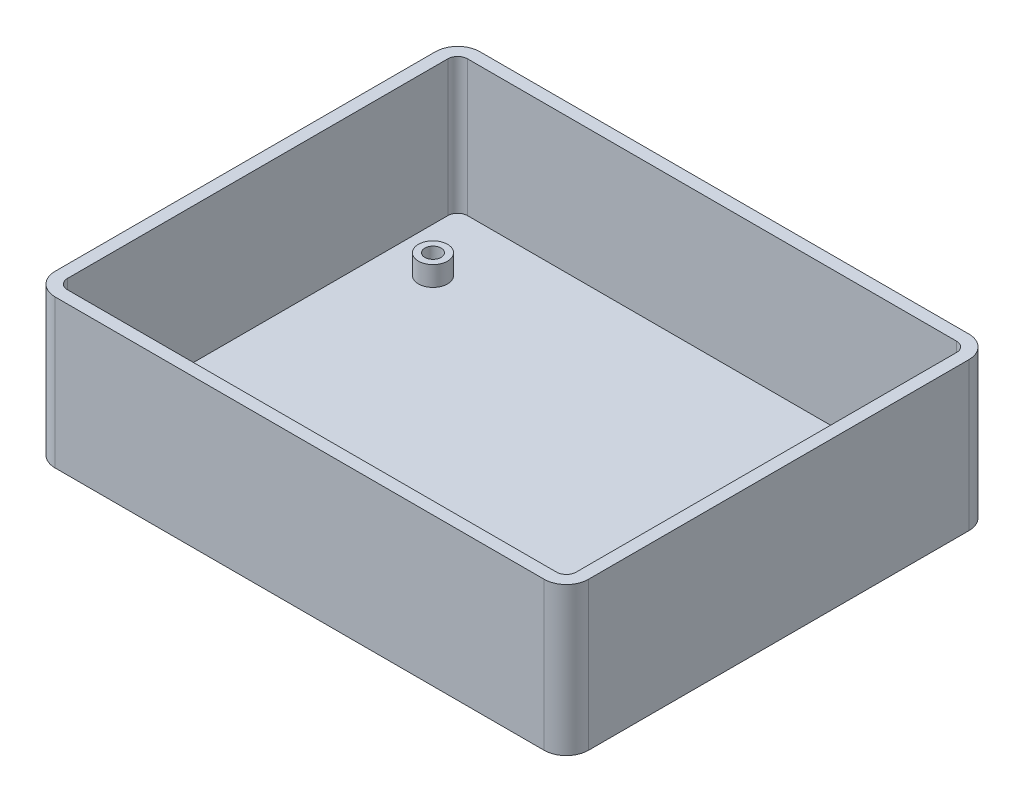
ISO-10303-21;
HEADER;
FILE_DESCRIPTION(('STEP AP214'),'2;1');
FILE_NAME('part.step','',(''),(''),'','','');
FILE_SCHEMA(('AUTOMOTIVE_DESIGN { 1 0 10303 214 1 1 1 1 }'));
ENDSEC;
DATA;
#1=APPLICATION_CONTEXT('core data for automotive mechanical design processes');
#2=APPLICATION_PROTOCOL_DEFINITION('international standard','automotive_design',2000,#1);
#3=PRODUCT_CONTEXT('',#1,'mechanical');
#4=PRODUCT('Part','Part','',(#3));
#5=PRODUCT_RELATED_PRODUCT_CATEGORY('part','',(#4));
#6=PRODUCT_DEFINITION_FORMATION('','',#4);
#7=PRODUCT_DEFINITION_CONTEXT('part definition',#1,'design');
#8=PRODUCT_DEFINITION('design','',#6,#7);
#9=PRODUCT_DEFINITION_SHAPE('','',#8);
#10=(LENGTH_UNIT() NAMED_UNIT(*) SI_UNIT(.MILLI.,.METRE.));
#11=(NAMED_UNIT(*) PLANE_ANGLE_UNIT() SI_UNIT($,.RADIAN.));
#12=(NAMED_UNIT(*) SI_UNIT($,.STERADIAN.) SOLID_ANGLE_UNIT());
#13=UNCERTAINTY_MEASURE_WITH_UNIT(LENGTH_MEASURE(1.E-05),#10,'distance_accuracy_value','');
#14=(GEOMETRIC_REPRESENTATION_CONTEXT(3) GLOBAL_UNCERTAINTY_ASSIGNED_CONTEXT((#13)) GLOBAL_UNIT_ASSIGNED_CONTEXT((#10,
#11,#12)) REPRESENTATION_CONTEXT('',''));
#15=CARTESIAN_POINT('',(0.,0.,0.));
#16=DIRECTION('',(0.,0.,1.));
#17=DIRECTION('',(1.,0.,0.));
#18=AXIS2_PLACEMENT_3D('',#15,#16,#17);
#19=CARTESIAN_POINT('',(0.,2.5,0.));
#20=DIRECTION('',(0.,1.,0.));
#21=DIRECTION('',(0.,0.,1.));
#22=AXIS2_PLACEMENT_3D('',#19,#20,#21);
#23=PLANE('',#22);
#24=CARTESIAN_POINT('',(41.,2.5,-31.));
#25=DIRECTION('',(0.,1.,0.));
#26=DIRECTION('',(0.,0.,1.));
#27=AXIS2_PLACEMENT_3D('',#24,#25,#26);
#28=CIRCLE('',#27,2.95);
#29=CARTESIAN_POINT('',(41.,2.5,-28.05));
#30=VERTEX_POINT('',#29);
#31=EDGE_CURVE('E697',#30,#30,#28,.T.);
#32=ORIENTED_EDGE('',*,*,#31,.F.);
#33=EDGE_LOOP('',(#32));
#34=FACE_BOUND('',#33,.T.);
#35=CARTESIAN_POINT('',(-41.,2.5,31.));
#36=DIRECTION('',(0.,1.,0.));
#37=DIRECTION('',(0.,0.,1.));
#38=AXIS2_PLACEMENT_3D('',#35,#36,#37);
#39=CIRCLE('',#38,2.95);
#40=CARTESIAN_POINT('',(-41.,2.5,33.95));
#41=VERTEX_POINT('',#40);
#42=EDGE_CURVE('E183',#41,#41,#39,.T.);
#43=ORIENTED_EDGE('',*,*,#42,.F.);
#44=EDGE_LOOP('',(#43));
#45=FACE_BOUND('',#44,.T.);
#46=DIRECTION('',(1.,0.,0.));
#47=VECTOR('',#46,1.);
#48=CARTESIAN_POINT('',(-50.,2.5,36.));
#49=LINE('',#48,#47);
#50=CARTESIAN_POINT('',(-48.,2.5,36.));
#51=VERTEX_POINT('',#50);
#52=CARTESIAN_POINT('',(51.,2.5,36.));
#53=VERTEX_POINT('',#52);
#54=EDGE_CURVE('E336',#51,#53,#49,.T.);
#55=ORIENTED_EDGE('',*,*,#54,.T.);
#56=CARTESIAN_POINT('',(51.,2.5,34.));
#57=DIRECTION('',(0.,1.,0.));
#58=DIRECTION('',(0.,0.,1.));
#59=AXIS2_PLACEMENT_3D('',#56,#57,#58);
#60=CIRCLE('',#59,2.);
#61=CARTESIAN_POINT('',(53.,2.5,34.));
#62=VERTEX_POINT('',#61);
#63=EDGE_CURVE('E11',#53,#62,#60,.T.);
#64=ORIENTED_EDGE('',*,*,#63,.T.);
#65=DIRECTION('',(0.,0.,-1.));
#66=VECTOR('',#65,1.);
#67=CARTESIAN_POINT('',(53.,2.5,-45.));
#68=LINE('',#67,#66);
#69=CARTESIAN_POINT('',(53.,2.5,-43.));
#70=VERTEX_POINT('',#69);
#71=EDGE_CURVE('E340',#62,#70,#68,.T.);
#72=ORIENTED_EDGE('',*,*,#71,.T.);
#73=CARTESIAN_POINT('',(51.,2.5,-43.));
#74=DIRECTION('',(0.,1.,0.));
#75=DIRECTION('',(0.,0.,1.));
#76=AXIS2_PLACEMENT_3D('',#73,#74,#75);
#77=CIRCLE('',#76,2.);
#78=CARTESIAN_POINT('',(51.,2.5,-45.));
#79=VERTEX_POINT('',#78);
#80=EDGE_CURVE('E48',#70,#79,#77,.T.);
#81=ORIENTED_EDGE('',*,*,#80,.T.);
#82=DIRECTION('',(-1.,0.,0.));
#83=VECTOR('',#82,1.);
#84=CARTESIAN_POINT('',(-50.,2.5,-45.));
#85=LINE('',#84,#83);
#86=CARTESIAN_POINT('',(-48.,2.5,-45.));
#87=VERTEX_POINT('',#86);
#88=EDGE_CURVE('E344',#79,#87,#85,.T.);
#89=ORIENTED_EDGE('',*,*,#88,.T.);
#90=CARTESIAN_POINT('',(-48.,2.5,-43.));
#91=DIRECTION('',(0.,1.,0.));
#92=DIRECTION('',(0.,0.,1.));
#93=AXIS2_PLACEMENT_3D('',#90,#91,#92);
#94=CIRCLE('',#93,2.);
#95=CARTESIAN_POINT('',(-50.,2.5,-43.));
#96=VERTEX_POINT('',#95);
#97=EDGE_CURVE('E348',#87,#96,#94,.T.);
#98=ORIENTED_EDGE('',*,*,#97,.T.);
#99=DIRECTION('',(0.,0.,1.));
#100=VECTOR('',#99,1.);
#101=CARTESIAN_POINT('',(-50.,2.5,-45.));
#102=LINE('',#101,#100);
#103=CARTESIAN_POINT('',(-50.,2.5,34.));
#104=VERTEX_POINT('',#103);
#105=EDGE_CURVE('E333',#96,#104,#102,.T.);
#106=ORIENTED_EDGE('',*,*,#105,.T.);
#107=CARTESIAN_POINT('',(-48.,2.5,34.));
#108=DIRECTION('',(0.,1.,0.));
#109=DIRECTION('',(0.,0.,1.));
#110=AXIS2_PLACEMENT_3D('',#107,#108,#109);
#111=CIRCLE('',#110,2.);
#112=EDGE_CURVE('E158',#104,#51,#111,.T.);
#113=ORIENTED_EDGE('',*,*,#112,.T.);
#114=EDGE_LOOP('',(#55,#64,#72,#81,#89,#98,#106,#113));
#115=FACE_BOUND('',#114,.T.);
#116=CARTESIAN_POINT('',(41.,2.5,31.));
#117=DIRECTION('',(0.,1.,0.));
#118=DIRECTION('',(0.,0.,1.));
#119=AXIS2_PLACEMENT_3D('',#116,#117,#118);
#120=CIRCLE('',#119,2.95);
#121=CARTESIAN_POINT('',(41.,2.5,33.95));
#122=VERTEX_POINT('',#121);
#123=EDGE_CURVE('E709',#122,#122,#120,.T.);
#124=ORIENTED_EDGE('',*,*,#123,.F.);
#125=EDGE_LOOP('',(#124));
#126=FACE_BOUND('',#125,.T.);
#127=CARTESIAN_POINT('',(-41.,2.5,-31.));
#128=DIRECTION('',(0.,1.,0.));
#129=DIRECTION('',(0.,0.,1.));
#130=AXIS2_PLACEMENT_3D('',#127,#128,#129);
#131=CIRCLE('',#130,2.95);
#132=CARTESIAN_POINT('',(-41.,2.5,-28.05));
#133=VERTEX_POINT('',#132);
#134=EDGE_CURVE('E682',#133,#133,#131,.T.);
#135=ORIENTED_EDGE('',*,*,#134,.F.);
#136=EDGE_LOOP('',(#135));
#137=FACE_BOUND('',#136,.T.);
#138=ADVANCED_FACE('F39',(#34,#45,#115,#126,#137),#23,.T.);
#139=CARTESIAN_POINT('',(0.,0.,0.));
#140=DIRECTION('',(0.,1.,0.));
#141=DIRECTION('',(0.,0.,1.));
#142=AXIS2_PLACEMENT_3D('',#139,#140,#141);
#143=PLANE('',#142);
#144=CARTESIAN_POINT('',(41.,0.,-31.));
#145=DIRECTION('',(0.,1.,0.));
#146=DIRECTION('',(0.,0.,1.));
#147=AXIS2_PLACEMENT_3D('',#144,#145,#146);
#148=CIRCLE('',#147,1.65);
#149=CARTESIAN_POINT('',(41.,0.,-29.35));
#150=VERTEX_POINT('',#149);
#151=EDGE_CURVE('E329',#150,#150,#148,.T.);
#152=ORIENTED_EDGE('',*,*,#151,.T.);
#153=EDGE_LOOP('',(#152));
#154=FACE_BOUND('',#153,.T.);
#155=CARTESIAN_POINT('',(41.,0.,31.));
#156=DIRECTION('',(0.,1.,0.));
#157=DIRECTION('',(0.,0.,1.));
#158=AXIS2_PLACEMENT_3D('',#155,#156,#157);
#159=CIRCLE('',#158,1.65);
#160=CARTESIAN_POINT('',(41.,0.,32.65));
#161=VERTEX_POINT('',#160);
#162=EDGE_CURVE('E325',#161,#161,#159,.T.);
#163=ORIENTED_EDGE('',*,*,#162,.T.);
#164=EDGE_LOOP('',(#163));
#165=FACE_BOUND('',#164,.T.);
#166=CARTESIAN_POINT('',(-41.,0.,31.));
#167=DIRECTION('',(0.,1.,0.));
#168=DIRECTION('',(0.,0.,1.));
#169=AXIS2_PLACEMENT_3D('',#166,#167,#168);
#170=CIRCLE('',#169,1.65);
#171=CARTESIAN_POINT('',(-41.,0.,32.65));
#172=VERTEX_POINT('',#171);
#173=EDGE_CURVE('E321',#172,#172,#170,.T.);
#174=ORIENTED_EDGE('',*,*,#173,.T.);
#175=EDGE_LOOP('',(#174));
#176=FACE_BOUND('',#175,.T.);
#177=CARTESIAN_POINT('',(-41.,0.,-31.));
#178=DIRECTION('',(0.,1.,0.));
#179=DIRECTION('',(0.,0.,1.));
#180=AXIS2_PLACEMENT_3D('',#177,#178,#179);
#181=CIRCLE('',#180,1.65);
#182=CARTESIAN_POINT('',(-41.,0.,-29.35));
#183=VERTEX_POINT('',#182);
#184=EDGE_CURVE('E297',#183,#183,#181,.T.);
#185=ORIENTED_EDGE('',*,*,#184,.T.);
#186=EDGE_LOOP('',(#185));
#187=FACE_BOUND('',#186,.T.);
#188=CARTESIAN_POINT('',(51.,0.,34.));
#189=DIRECTION('',(0.,-1.,0.));
#190=DIRECTION('',(0.,0.,-1.));
#191=AXIS2_PLACEMENT_3D('',#188,#189,#190);
#192=CIRCLE('',#191,4.5);
#193=CARTESIAN_POINT('',(55.5,0.,34.));
#194=VERTEX_POINT('',#193);
#195=CARTESIAN_POINT('',(51.,0.,38.5));
#196=VERTEX_POINT('',#195);
#197=EDGE_CURVE('E209',#194,#196,#192,.T.);
#198=ORIENTED_EDGE('',*,*,#197,.T.);
#199=DIRECTION('',(-1.,0.,0.));
#200=VECTOR('',#199,1.);
#201=CARTESIAN_POINT('',(51.,0.,38.5));
#202=LINE('',#201,#200);
#203=CARTESIAN_POINT('',(-48.,0.,38.5));
#204=VERTEX_POINT('',#203);
#205=EDGE_CURVE('E267',#196,#204,#202,.T.);
#206=ORIENTED_EDGE('',*,*,#205,.T.);
#207=CARTESIAN_POINT('',(-48.,0.,34.));
#208=DIRECTION('',(0.,-1.,0.));
#209=DIRECTION('',(0.,0.,-1.));
#210=AXIS2_PLACEMENT_3D('',#207,#208,#209);
#211=CIRCLE('',#210,4.5);
#212=CARTESIAN_POINT('',(-52.5,0.,34.));
#213=VERTEX_POINT('',#212);
#214=EDGE_CURVE('E271',#204,#213,#211,.T.);
#215=ORIENTED_EDGE('',*,*,#214,.T.);
#216=DIRECTION('',(0.,0.,-1.));
#217=VECTOR('',#216,1.);
#218=CARTESIAN_POINT('',(-52.5,0.,34.));
#219=LINE('',#218,#217);
#220=CARTESIAN_POINT('',(-52.5,0.,-43.));
#221=VERTEX_POINT('',#220);
#222=EDGE_CURVE('E275',#213,#221,#219,.T.);
#223=ORIENTED_EDGE('',*,*,#222,.T.);
#224=CARTESIAN_POINT('',(-48.,0.,-43.));
#225=DIRECTION('',(0.,-1.,0.));
#226=DIRECTION('',(0.,0.,-1.));
#227=AXIS2_PLACEMENT_3D('',#224,#225,#226);
#228=CIRCLE('',#227,4.5);
#229=CARTESIAN_POINT('',(-48.,0.,-47.5));
#230=VERTEX_POINT('',#229);
#231=EDGE_CURVE('E279',#221,#230,#228,.T.);
#232=ORIENTED_EDGE('',*,*,#231,.T.);
#233=DIRECTION('',(1.,0.,0.));
#234=VECTOR('',#233,1.);
#235=CARTESIAN_POINT('',(-48.,0.,-47.5));
#236=LINE('',#235,#234);
#237=CARTESIAN_POINT('',(51.,0.,-47.5));
#238=VERTEX_POINT('',#237);
#239=EDGE_CURVE('E283',#230,#238,#236,.T.);
#240=ORIENTED_EDGE('',*,*,#239,.T.);
#241=CARTESIAN_POINT('',(51.,0.,-43.));
#242=DIRECTION('',(0.,-1.,0.));
#243=DIRECTION('',(0.,0.,-1.));
#244=AXIS2_PLACEMENT_3D('',#241,#242,#243);
#245=CIRCLE('',#244,4.5);
#246=CARTESIAN_POINT('',(55.5,0.,-43.));
#247=VERTEX_POINT('',#246);
#248=EDGE_CURVE('E287',#238,#247,#245,.T.);
#249=ORIENTED_EDGE('',*,*,#248,.T.);
#250=DIRECTION('',(0.,0.,1.));
#251=VECTOR('',#250,1.);
#252=CARTESIAN_POINT('',(55.5,0.,-43.));
#253=LINE('',#252,#251);
#254=EDGE_CURVE('E235',#247,#194,#253,.T.);
#255=ORIENTED_EDGE('',*,*,#254,.T.);
#256=EDGE_LOOP('',(#198,#206,#215,#223,#232,#240,#249,#255));
#257=FACE_BOUND('',#256,.T.);
#258=ADVANCED_FACE('F41',(#154,#165,#176,#187,#257),#143,.F.);
#259=CARTESIAN_POINT('',(41.,2.5,-31.));
#260=DIRECTION('',(0.,-1.,0.));
#261=DIRECTION('',(0.,0.,-1.));
#262=AXIS2_PLACEMENT_3D('',#259,#260,#261);
#263=CYLINDRICAL_SURFACE('',#262,1.65);
#264=ORIENTED_EDGE('',*,*,#151,.F.);
#265=EDGE_LOOP('',(#264));
#266=FACE_BOUND('',#265,.T.);
#267=CARTESIAN_POINT('',(41.,6.5,-31.));
#268=DIRECTION('',(0.,1.,0.));
#269=DIRECTION('',(0.,0.,1.));
#270=AXIS2_PLACEMENT_3D('',#267,#268,#269);
#271=CIRCLE('',#270,1.65);
#272=CARTESIAN_POINT('',(41.,6.5,-29.35));
#273=VERTEX_POINT('',#272);
#274=EDGE_CURVE('E689',#273,#273,#271,.T.);
#275=ORIENTED_EDGE('',*,*,#274,.T.);
#276=EDGE_LOOP('',(#275));
#277=FACE_BOUND('',#276,.T.);
#278=ADVANCED_FACE('F385',(#266,#277),#263,.F.);
#279=CARTESIAN_POINT('',(41.,2.5,31.));
#280=DIRECTION('',(0.,-1.,0.));
#281=DIRECTION('',(0.,0.,-1.));
#282=AXIS2_PLACEMENT_3D('',#279,#280,#281);
#283=CYLINDRICAL_SURFACE('',#282,1.65);
#284=ORIENTED_EDGE('',*,*,#162,.F.);
#285=EDGE_LOOP('',(#284));
#286=FACE_BOUND('',#285,.T.);
#287=CARTESIAN_POINT('',(41.,6.5,31.));
#288=DIRECTION('',(0.,1.,0.));
#289=DIRECTION('',(0.,0.,1.));
#290=AXIS2_PLACEMENT_3D('',#287,#288,#289);
#291=CIRCLE('',#290,1.65);
#292=CARTESIAN_POINT('',(41.,6.5,32.65));
#293=VERTEX_POINT('',#292);
#294=EDGE_CURVE('E702',#293,#293,#291,.T.);
#295=ORIENTED_EDGE('',*,*,#294,.T.);
#296=EDGE_LOOP('',(#295));
#297=FACE_BOUND('',#296,.T.);
#298=ADVANCED_FACE('F392',(#286,#297),#283,.F.);
#299=CARTESIAN_POINT('',(-41.,2.5,31.));
#300=DIRECTION('',(0.,-1.,0.));
#301=DIRECTION('',(0.,0.,-1.));
#302=AXIS2_PLACEMENT_3D('',#299,#300,#301);
#303=CYLINDRICAL_SURFACE('',#302,1.65);
#304=ORIENTED_EDGE('',*,*,#173,.F.);
#305=EDGE_LOOP('',(#304));
#306=FACE_BOUND('',#305,.T.);
#307=CARTESIAN_POINT('',(-41.,6.5,31.));
#308=DIRECTION('',(0.,1.,0.));
#309=DIRECTION('',(0.,0.,1.));
#310=AXIS2_PLACEMENT_3D('',#307,#308,#309);
#311=CIRCLE('',#310,1.65);
#312=CARTESIAN_POINT('',(-41.,6.5,32.65));
#313=VERTEX_POINT('',#312);
#314=EDGE_CURVE('E714',#313,#313,#311,.T.);
#315=ORIENTED_EDGE('',*,*,#314,.T.);
#316=EDGE_LOOP('',(#315));
#317=FACE_BOUND('',#316,.T.);
#318=ADVANCED_FACE('F396',(#306,#317),#303,.F.);
#319=CARTESIAN_POINT('',(-41.,2.5,-31.));
#320=DIRECTION('',(0.,-1.,0.));
#321=DIRECTION('',(0.,0.,-1.));
#322=AXIS2_PLACEMENT_3D('',#319,#320,#321);
#323=CYLINDRICAL_SURFACE('',#322,1.65);
#324=ORIENTED_EDGE('',*,*,#184,.F.);
#325=EDGE_LOOP('',(#324));
#326=FACE_BOUND('',#325,.T.);
#327=CARTESIAN_POINT('',(-41.,6.5,-31.));
#328=DIRECTION('',(0.,1.,0.));
#329=DIRECTION('',(0.,0.,1.));
#330=AXIS2_PLACEMENT_3D('',#327,#328,#329);
#331=CIRCLE('',#330,1.65);
#332=CARTESIAN_POINT('',(-41.,6.5,-29.35));
#333=VERTEX_POINT('',#332);
#334=EDGE_CURVE('E685',#333,#333,#331,.T.);
#335=ORIENTED_EDGE('',*,*,#334,.T.);
#336=EDGE_LOOP('',(#335));
#337=FACE_BOUND('',#336,.T.);
#338=ADVANCED_FACE('F400',(#326,#337),#323,.F.);
#339=CARTESIAN_POINT('',(51.,30.,34.));
#340=DIRECTION('',(0.,-1.,0.));
#341=DIRECTION('',(0.,0.,-1.));
#342=AXIS2_PLACEMENT_3D('',#339,#340,#341);
#343=CYLINDRICAL_SURFACE('',#342,4.5);
#344=ORIENTED_EDGE('',*,*,#197,.F.);
#345=DIRECTION('',(0.,-1.,0.));
#346=VECTOR('',#345,1.);
#347=CARTESIAN_POINT('',(55.5,30.,34.));
#348=LINE('',#347,#346);
#349=CARTESIAN_POINT('',(55.5,30.,34.));
#350=VERTEX_POINT('',#349);
#351=EDGE_CURVE('E294',#350,#194,#348,.T.);
#352=ORIENTED_EDGE('',*,*,#351,.F.);
#353=CARTESIAN_POINT('',(51.,30.,34.));
#354=DIRECTION('',(0.,-1.,0.));
#355=DIRECTION('',(0.,0.,-1.));
#356=AXIS2_PLACEMENT_3D('',#353,#354,#355);
#357=CIRCLE('',#356,4.5);
#358=CARTESIAN_POINT('',(51.,30.,38.5));
#359=VERTEX_POINT('',#358);
#360=EDGE_CURVE('E230',#350,#359,#357,.T.);
#361=ORIENTED_EDGE('',*,*,#360,.T.);
#362=DIRECTION('',(0.,-1.,0.));
#363=VECTOR('',#362,1.);
#364=CARTESIAN_POINT('',(51.,30.,38.5));
#365=LINE('',#364,#363);
#366=EDGE_CURVE('E263',#359,#196,#365,.T.);
#367=ORIENTED_EDGE('',*,*,#366,.T.);
#368=EDGE_LOOP('',(#344,#352,#361,#367));
#369=FACE_BOUND('',#368,.T.);
#370=ADVANCED_FACE('F404',(#369),#343,.T.);
#371=CARTESIAN_POINT('',(55.5,30.,-43.));
#372=DIRECTION('',(1.,0.,0.));
#373=DIRECTION('',(0.,0.,-1.));
#374=AXIS2_PLACEMENT_3D('',#371,#372,#373);
#375=PLANE('',#374);
#376=ORIENTED_EDGE('',*,*,#254,.F.);
#377=DIRECTION('',(0.,-1.,0.));
#378=VECTOR('',#377,1.);
#379=CARTESIAN_POINT('',(55.5,30.,-43.));
#380=LINE('',#379,#378);
#381=CARTESIAN_POINT('',(55.5,30.,-43.));
#382=VERTEX_POINT('',#381);
#383=EDGE_CURVE('E298',#382,#247,#380,.T.);
#384=ORIENTED_EDGE('',*,*,#383,.F.);
#385=DIRECTION('',(0.,0.,1.));
#386=VECTOR('',#385,1.);
#387=CARTESIAN_POINT('',(55.5,30.,-43.));
#388=LINE('',#387,#386);
#389=EDGE_CURVE('E259',#382,#350,#388,.T.);
#390=ORIENTED_EDGE('',*,*,#389,.T.);
#391=ORIENTED_EDGE('',*,*,#351,.T.);
#392=EDGE_LOOP('',(#376,#384,#390,#391));
#393=FACE_BOUND('',#392,.T.);
#394=ADVANCED_FACE('F408',(#393),#375,.T.);
#395=CARTESIAN_POINT('',(51.,30.,-43.));
#396=DIRECTION('',(0.,-1.,0.));
#397=DIRECTION('',(0.,0.,-1.));
#398=AXIS2_PLACEMENT_3D('',#395,#396,#397);
#399=CYLINDRICAL_SURFACE('',#398,4.5);
#400=ORIENTED_EDGE('',*,*,#248,.F.);
#401=DIRECTION('',(0.,-1.,0.));
#402=VECTOR('',#401,1.);
#403=CARTESIAN_POINT('',(51.,30.,-47.5));
#404=LINE('',#403,#402);
#405=CARTESIAN_POINT('',(51.,30.,-47.5));
#406=VERTEX_POINT('',#405);
#407=EDGE_CURVE('E301',#406,#238,#404,.T.);
#408=ORIENTED_EDGE('',*,*,#407,.F.);
#409=CARTESIAN_POINT('',(51.,30.,-43.));
#410=DIRECTION('',(0.,-1.,0.));
#411=DIRECTION('',(0.,0.,-1.));
#412=AXIS2_PLACEMENT_3D('',#409,#410,#411);
#413=CIRCLE('',#412,4.5);
#414=EDGE_CURVE('E255',#406,#382,#413,.T.);
#415=ORIENTED_EDGE('',*,*,#414,.T.);
#416=ORIENTED_EDGE('',*,*,#383,.T.);
#417=EDGE_LOOP('',(#400,#408,#415,#416));
#418=FACE_BOUND('',#417,.T.);
#419=ADVANCED_FACE('F429',(#418),#399,.T.);
#420=CARTESIAN_POINT('',(-48.,30.,-47.5));
#421=DIRECTION('',(0.,0.,-1.));
#422=DIRECTION('',(-1.,0.,0.));
#423=AXIS2_PLACEMENT_3D('',#420,#421,#422);
#424=PLANE('',#423);
#425=ORIENTED_EDGE('',*,*,#239,.F.);
#426=DIRECTION('',(0.,-1.,0.));
#427=VECTOR('',#426,1.);
#428=CARTESIAN_POINT('',(-48.,30.,-47.5));
#429=LINE('',#428,#427);
#430=CARTESIAN_POINT('',(-48.,30.,-47.5));
#431=VERTEX_POINT('',#430);
#432=EDGE_CURVE('E304',#431,#230,#429,.T.);
#433=ORIENTED_EDGE('',*,*,#432,.F.);
#434=DIRECTION('',(1.,0.,0.));
#435=VECTOR('',#434,1.);
#436=CARTESIAN_POINT('',(-48.,30.,-47.5));
#437=LINE('',#436,#435);
#438=EDGE_CURVE('E251',#431,#406,#437,.T.);
#439=ORIENTED_EDGE('',*,*,#438,.T.);
#440=ORIENTED_EDGE('',*,*,#407,.T.);
#441=EDGE_LOOP('',(#425,#433,#439,#440));
#442=FACE_BOUND('',#441,.T.);
#443=ADVANCED_FACE('F425',(#442),#424,.T.);
#444=CARTESIAN_POINT('',(-48.,30.,-43.));
#445=DIRECTION('',(0.,-1.,0.));
#446=DIRECTION('',(0.,0.,-1.));
#447=AXIS2_PLACEMENT_3D('',#444,#445,#446);
#448=CYLINDRICAL_SURFACE('',#447,4.5);
#449=ORIENTED_EDGE('',*,*,#231,.F.);
#450=DIRECTION('',(0.,-1.,0.));
#451=VECTOR('',#450,1.);
#452=CARTESIAN_POINT('',(-52.5,30.,-43.));
#453=LINE('',#452,#451);
#454=CARTESIAN_POINT('',(-52.5,30.,-43.));
#455=VERTEX_POINT('',#454);
#456=EDGE_CURVE('E307',#455,#221,#453,.T.);
#457=ORIENTED_EDGE('',*,*,#456,.F.);
#458=CARTESIAN_POINT('',(-48.,30.,-43.));
#459=DIRECTION('',(0.,-1.,0.));
#460=DIRECTION('',(0.,0.,-1.));
#461=AXIS2_PLACEMENT_3D('',#458,#459,#460);
#462=CIRCLE('',#461,4.5);
#463=EDGE_CURVE('E247',#455,#431,#462,.T.);
#464=ORIENTED_EDGE('',*,*,#463,.T.);
#465=ORIENTED_EDGE('',*,*,#432,.T.);
#466=EDGE_LOOP('',(#449,#457,#464,#465));
#467=FACE_BOUND('',#466,.T.);
#468=ADVANCED_FACE('F421',(#467),#448,.T.);
#469=CARTESIAN_POINT('',(-52.5,30.,34.));
#470=DIRECTION('',(-1.,0.,0.));
#471=DIRECTION('',(0.,0.,1.));
#472=AXIS2_PLACEMENT_3D('',#469,#470,#471);
#473=PLANE('',#472);
#474=ORIENTED_EDGE('',*,*,#222,.F.);
#475=DIRECTION('',(0.,-1.,0.));
#476=VECTOR('',#475,1.);
#477=CARTESIAN_POINT('',(-52.5,30.,34.));
#478=LINE('',#477,#476);
#479=CARTESIAN_POINT('',(-52.5,30.,34.));
#480=VERTEX_POINT('',#479);
#481=EDGE_CURVE('E310',#480,#213,#478,.T.);
#482=ORIENTED_EDGE('',*,*,#481,.F.);
#483=DIRECTION('',(0.,0.,-1.));
#484=VECTOR('',#483,1.);
#485=CARTESIAN_POINT('',(-52.5,30.,34.));
#486=LINE('',#485,#484);
#487=EDGE_CURVE('E243',#480,#455,#486,.T.);
#488=ORIENTED_EDGE('',*,*,#487,.T.);
#489=ORIENTED_EDGE('',*,*,#456,.T.);
#490=EDGE_LOOP('',(#474,#482,#488,#489));
#491=FACE_BOUND('',#490,.T.);
#492=ADVANCED_FACE('F417',(#491),#473,.T.);
#493=CARTESIAN_POINT('',(-48.,30.,34.));
#494=DIRECTION('',(0.,-1.,0.));
#495=DIRECTION('',(0.,0.,-1.));
#496=AXIS2_PLACEMENT_3D('',#493,#494,#495);
#497=CYLINDRICAL_SURFACE('',#496,4.5);
#498=ORIENTED_EDGE('',*,*,#214,.F.);
#499=DIRECTION('',(0.,-1.,0.));
#500=VECTOR('',#499,1.);
#501=CARTESIAN_POINT('',(-48.,30.,38.5));
#502=LINE('',#501,#500);
#503=CARTESIAN_POINT('',(-48.,30.,38.5));
#504=VERTEX_POINT('',#503);
#505=EDGE_CURVE('E313',#504,#204,#502,.T.);
#506=ORIENTED_EDGE('',*,*,#505,.F.);
#507=CARTESIAN_POINT('',(-48.,30.,34.));
#508=DIRECTION('',(0.,-1.,0.));
#509=DIRECTION('',(0.,0.,-1.));
#510=AXIS2_PLACEMENT_3D('',#507,#508,#509);
#511=CIRCLE('',#510,4.5);
#512=EDGE_CURVE('E239',#504,#480,#511,.T.);
#513=ORIENTED_EDGE('',*,*,#512,.T.);
#514=ORIENTED_EDGE('',*,*,#481,.T.);
#515=EDGE_LOOP('',(#498,#506,#513,#514));
#516=FACE_BOUND('',#515,.T.);
#517=ADVANCED_FACE('F413',(#516),#497,.T.);
#518=CARTESIAN_POINT('',(51.,30.,38.5));
#519=DIRECTION('',(0.,0.,1.));
#520=DIRECTION('',(1.,0.,0.));
#521=AXIS2_PLACEMENT_3D('',#518,#519,#520);
#522=PLANE('',#521);
#523=ORIENTED_EDGE('',*,*,#205,.F.);
#524=ORIENTED_EDGE('',*,*,#366,.F.);
#525=DIRECTION('',(-1.,0.,0.));
#526=VECTOR('',#525,1.);
#527=CARTESIAN_POINT('',(51.,30.,38.5));
#528=LINE('',#527,#526);
#529=EDGE_CURVE('E234',#359,#504,#528,.T.);
#530=ORIENTED_EDGE('',*,*,#529,.T.);
#531=ORIENTED_EDGE('',*,*,#505,.T.);
#532=EDGE_LOOP('',(#523,#524,#530,#531));
#533=FACE_BOUND('',#532,.T.);
#534=ADVANCED_FACE('F410',(#533),#522,.T.);
#535=CARTESIAN_POINT('',(51.,30.,34.));
#536=DIRECTION('',(0.,-1.,0.));
#537=DIRECTION('',(0.,0.,-1.));
#538=AXIS2_PLACEMENT_3D('',#535,#536,#537);
#539=PLANE('',#538);
#540=DIRECTION('',(-1.,0.,0.));
#541=VECTOR('',#540,1.);
#542=CARTESIAN_POINT('',(51.,30.,36.));
#543=LINE('',#542,#541);
#544=CARTESIAN_POINT('',(51.,30.,36.));
#545=VERTEX_POINT('',#544);
#546=CARTESIAN_POINT('',(-48.,30.,36.));
#547=VERTEX_POINT('',#546);
#548=EDGE_CURVE('E162',#545,#547,#543,.T.);
#549=ORIENTED_EDGE('',*,*,#548,.T.);
#550=CARTESIAN_POINT('',(-48.,30.,34.));
#551=DIRECTION('',(0.,-1.,0.));
#552=DIRECTION('',(0.,0.,-1.));
#553=AXIS2_PLACEMENT_3D('',#550,#551,#552);
#554=CIRCLE('',#553,2.);
#555=CARTESIAN_POINT('',(-50.,30.,34.));
#556=VERTEX_POINT('',#555);
#557=EDGE_CURVE('E155',#547,#556,#554,.T.);
#558=ORIENTED_EDGE('',*,*,#557,.T.);
#559=DIRECTION('',(0.,0.,-1.));
#560=VECTOR('',#559,1.);
#561=CARTESIAN_POINT('',(-50.,30.,34.));
#562=LINE('',#561,#560);
#563=CARTESIAN_POINT('',(-50.,30.,-43.));
#564=VERTEX_POINT('',#563);
#565=EDGE_CURVE('E166',#556,#564,#562,.T.);
#566=ORIENTED_EDGE('',*,*,#565,.T.);
#567=CARTESIAN_POINT('',(-48.,30.,-43.));
#568=DIRECTION('',(0.,-1.,0.));
#569=DIRECTION('',(0.,0.,-1.));
#570=AXIS2_PLACEMENT_3D('',#567,#568,#569);
#571=CIRCLE('',#570,2.);
#572=CARTESIAN_POINT('',(-48.,30.,-45.));
#573=VERTEX_POINT('',#572);
#574=EDGE_CURVE('E172',#564,#573,#571,.T.);
#575=ORIENTED_EDGE('',*,*,#574,.T.);
#576=DIRECTION('',(1.,0.,0.));
#577=VECTOR('',#576,1.);
#578=CARTESIAN_POINT('',(-48.,30.,-45.));
#579=LINE('',#578,#577);
#580=CARTESIAN_POINT('',(51.,30.,-45.));
#581=VERTEX_POINT('',#580);
#582=EDGE_CURVE('E189',#573,#581,#579,.T.);
#583=ORIENTED_EDGE('',*,*,#582,.T.);
#584=CARTESIAN_POINT('',(51.,30.,-43.));
#585=DIRECTION('',(0.,-1.,0.));
#586=DIRECTION('',(0.,0.,-1.));
#587=AXIS2_PLACEMENT_3D('',#584,#585,#586);
#588=CIRCLE('',#587,2.);
#589=CARTESIAN_POINT('',(53.,30.,-43.));
#590=VERTEX_POINT('',#589);
#591=EDGE_CURVE('E193',#581,#590,#588,.T.);
#592=ORIENTED_EDGE('',*,*,#591,.T.);
#593=DIRECTION('',(0.,0.,1.));
#594=VECTOR('',#593,1.);
#595=CARTESIAN_POINT('',(53.,30.,-43.));
#596=LINE('',#595,#594);
#597=CARTESIAN_POINT('',(53.,30.,34.));
#598=VERTEX_POINT('',#597);
#599=EDGE_CURVE('E197',#590,#598,#596,.T.);
#600=ORIENTED_EDGE('',*,*,#599,.T.);
#601=CARTESIAN_POINT('',(51.,30.,34.));
#602=DIRECTION('',(0.,-1.,0.));
#603=DIRECTION('',(0.,0.,-1.));
#604=AXIS2_PLACEMENT_3D('',#601,#602,#603);
#605=CIRCLE('',#604,2.);
#606=EDGE_CURVE('E201',#598,#545,#605,.T.);
#607=ORIENTED_EDGE('',*,*,#606,.T.);
#608=EDGE_LOOP('',(#549,#558,#566,#575,#583,#592,#600,#607));
#609=FACE_BOUND('',#608,.T.);
#610=ORIENTED_EDGE('',*,*,#360,.F.);
#611=ORIENTED_EDGE('',*,*,#389,.F.);
#612=ORIENTED_EDGE('',*,*,#414,.F.);
#613=ORIENTED_EDGE('',*,*,#438,.F.);
#614=ORIENTED_EDGE('',*,*,#463,.F.);
#615=ORIENTED_EDGE('',*,*,#487,.F.);
#616=ORIENTED_EDGE('',*,*,#512,.F.);
#617=ORIENTED_EDGE('',*,*,#529,.F.);
#618=EDGE_LOOP('',(#610,#611,#612,#613,#614,#615,#616,#617));
#619=FACE_BOUND('',#618,.T.);
#620=ADVANCED_FACE('F174',(#609,#619),#539,.F.);
#621=CARTESIAN_POINT('',(-48.,30.,34.));
#622=DIRECTION('',(0.,-1.,0.));
#623=DIRECTION('',(0.,0.,-1.));
#624=AXIS2_PLACEMENT_3D('',#621,#622,#623);
#625=CYLINDRICAL_SURFACE('',#624,2.);
#626=ORIENTED_EDGE('',*,*,#112,.F.);
#627=DIRECTION('',(0.,-1.,0.));
#628=VECTOR('',#627,1.);
#629=CARTESIAN_POINT('',(-50.,30.,34.));
#630=LINE('',#629,#628);
#631=EDGE_CURVE('E55',#556,#104,#630,.T.);
#632=ORIENTED_EDGE('',*,*,#631,.F.);
#633=ORIENTED_EDGE('',*,*,#557,.F.);
#634=DIRECTION('',(0.,-1.,0.));
#635=VECTOR('',#634,1.);
#636=CARTESIAN_POINT('',(-48.,30.,36.));
#637=LINE('',#636,#635);
#638=EDGE_CURVE('E206',#547,#51,#637,.T.);
#639=ORIENTED_EDGE('',*,*,#638,.T.);
#640=EDGE_LOOP('',(#626,#632,#633,#639));
#641=FACE_BOUND('',#640,.T.);
#642=ADVANCED_FACE('F152',(#641),#625,.F.);
#643=CARTESIAN_POINT('',(51.,30.,36.));
#644=DIRECTION('',(0.,0.,1.));
#645=DIRECTION('',(1.,0.,0.));
#646=AXIS2_PLACEMENT_3D('',#643,#644,#645);
#647=PLANE('',#646);
#648=ORIENTED_EDGE('',*,*,#54,.F.);
#649=ORIENTED_EDGE('',*,*,#638,.F.);
#650=ORIENTED_EDGE('',*,*,#548,.F.);
#651=DIRECTION('',(0.,-1.,0.));
#652=VECTOR('',#651,1.);
#653=CARTESIAN_POINT('',(51.,30.,36.));
#654=LINE('',#653,#652);
#655=EDGE_CURVE('E210',#545,#53,#654,.T.);
#656=ORIENTED_EDGE('',*,*,#655,.T.);
#657=EDGE_LOOP('',(#648,#649,#650,#656));
#658=FACE_BOUND('',#657,.T.);
#659=ADVANCED_FACE('F370',(#658),#647,.F.);
#660=CARTESIAN_POINT('',(51.,30.,34.));
#661=DIRECTION('',(0.,-1.,0.));
#662=DIRECTION('',(0.,0.,-1.));
#663=AXIS2_PLACEMENT_3D('',#660,#661,#662);
#664=CYLINDRICAL_SURFACE('',#663,2.);
#665=ORIENTED_EDGE('',*,*,#63,.F.);
#666=ORIENTED_EDGE('',*,*,#655,.F.);
#667=ORIENTED_EDGE('',*,*,#606,.F.);
#668=DIRECTION('',(0.,-1.,0.));
#669=VECTOR('',#668,1.);
#670=CARTESIAN_POINT('',(53.,30.,34.));
#671=LINE('',#670,#669);
#672=EDGE_CURVE('E214',#598,#62,#671,.T.);
#673=ORIENTED_EDGE('',*,*,#672,.T.);
#674=EDGE_LOOP('',(#665,#666,#667,#673));
#675=FACE_BOUND('',#674,.T.);
#676=ADVANCED_FACE('F361',(#675),#664,.F.);
#677=CARTESIAN_POINT('',(53.,30.,-43.));
#678=DIRECTION('',(1.,0.,0.));
#679=DIRECTION('',(0.,0.,-1.));
#680=AXIS2_PLACEMENT_3D('',#677,#678,#679);
#681=PLANE('',#680);
#682=ORIENTED_EDGE('',*,*,#71,.F.);
#683=ORIENTED_EDGE('',*,*,#672,.F.);
#684=ORIENTED_EDGE('',*,*,#599,.F.);
#685=DIRECTION('',(0.,-1.,0.));
#686=VECTOR('',#685,1.);
#687=CARTESIAN_POINT('',(53.,30.,-43.));
#688=LINE('',#687,#686);
#689=EDGE_CURVE('E218',#590,#70,#688,.T.);
#690=ORIENTED_EDGE('',*,*,#689,.T.);
#691=EDGE_LOOP('',(#682,#683,#684,#690));
#692=FACE_BOUND('',#691,.T.);
#693=ADVANCED_FACE('F357',(#692),#681,.F.);
#694=CARTESIAN_POINT('',(51.,30.,-43.));
#695=DIRECTION('',(0.,-1.,0.));
#696=DIRECTION('',(0.,0.,-1.));
#697=AXIS2_PLACEMENT_3D('',#694,#695,#696);
#698=CYLINDRICAL_SURFACE('',#697,2.);
#699=ORIENTED_EDGE('',*,*,#80,.F.);
#700=ORIENTED_EDGE('',*,*,#689,.F.);
#701=ORIENTED_EDGE('',*,*,#591,.F.);
#702=DIRECTION('',(0.,-1.,0.));
#703=VECTOR('',#702,1.);
#704=CARTESIAN_POINT('',(51.,30.,-45.));
#705=LINE('',#704,#703);
#706=EDGE_CURVE('E221',#581,#79,#705,.T.);
#707=ORIENTED_EDGE('',*,*,#706,.T.);
#708=EDGE_LOOP('',(#699,#700,#701,#707));
#709=FACE_BOUND('',#708,.T.);
#710=ADVANCED_FACE('F364',(#709),#698,.F.);
#711=CARTESIAN_POINT('',(-48.,30.,-45.));
#712=DIRECTION('',(0.,0.,-1.));
#713=DIRECTION('',(-1.,0.,0.));
#714=AXIS2_PLACEMENT_3D('',#711,#712,#713);
#715=PLANE('',#714);
#716=ORIENTED_EDGE('',*,*,#88,.F.);
#717=ORIENTED_EDGE('',*,*,#706,.F.);
#718=ORIENTED_EDGE('',*,*,#582,.F.);
#719=DIRECTION('',(0.,-1.,0.));
#720=VECTOR('',#719,1.);
#721=CARTESIAN_POINT('',(-48.,30.,-45.));
#722=LINE('',#721,#720);
#723=EDGE_CURVE('E224',#573,#87,#722,.T.);
#724=ORIENTED_EDGE('',*,*,#723,.T.);
#725=EDGE_LOOP('',(#716,#717,#718,#724));
#726=FACE_BOUND('',#725,.T.);
#727=ADVANCED_FACE('F366',(#726),#715,.F.);
#728=CARTESIAN_POINT('',(-48.,30.,-43.));
#729=DIRECTION('',(0.,-1.,0.));
#730=DIRECTION('',(0.,0.,-1.));
#731=AXIS2_PLACEMENT_3D('',#728,#729,#730);
#732=CYLINDRICAL_SURFACE('',#731,2.);
#733=ORIENTED_EDGE('',*,*,#97,.F.);
#734=ORIENTED_EDGE('',*,*,#723,.F.);
#735=ORIENTED_EDGE('',*,*,#574,.F.);
#736=DIRECTION('',(0.,-1.,0.));
#737=VECTOR('',#736,1.);
#738=CARTESIAN_POINT('',(-50.,30.,-43.));
#739=LINE('',#738,#737);
#740=EDGE_CURVE('E161',#564,#96,#739,.T.);
#741=ORIENTED_EDGE('',*,*,#740,.T.);
#742=EDGE_LOOP('',(#733,#734,#735,#741));
#743=FACE_BOUND('',#742,.T.);
#744=ADVANCED_FACE('F368',(#743),#732,.F.);
#745=CARTESIAN_POINT('',(-50.,30.,34.));
#746=DIRECTION('',(-1.,0.,0.));
#747=DIRECTION('',(0.,0.,1.));
#748=AXIS2_PLACEMENT_3D('',#745,#746,#747);
#749=PLANE('',#748);
#750=ORIENTED_EDGE('',*,*,#105,.F.);
#751=ORIENTED_EDGE('',*,*,#740,.F.);
#752=ORIENTED_EDGE('',*,*,#565,.F.);
#753=ORIENTED_EDGE('',*,*,#631,.T.);
#754=EDGE_LOOP('',(#750,#751,#752,#753));
#755=FACE_BOUND('',#754,.T.);
#756=ADVANCED_FACE('F167',(#755),#749,.F.);
#757=CARTESIAN_POINT('',(-41.,6.5,31.));
#758=DIRECTION('',(0.,1.,0.));
#759=DIRECTION('',(0.,0.,1.));
#760=AXIS2_PLACEMENT_3D('',#757,#758,#759);
#761=PLANE('',#760);
#762=CARTESIAN_POINT('',(-41.,6.5,31.));
#763=DIRECTION('',(0.,1.,0.));
#764=DIRECTION('',(0.,0.,1.));
#765=AXIS2_PLACEMENT_3D('',#762,#763,#764);
#766=CIRCLE('',#765,2.95);
#767=CARTESIAN_POINT('',(-41.,6.5,33.95));
#768=VERTEX_POINT('',#767);
#769=EDGE_CURVE('E179',#768,#768,#766,.T.);
#770=ORIENTED_EDGE('',*,*,#769,.T.);
#771=EDGE_LOOP('',(#770));
#772=FACE_BOUND('',#771,.T.);
#773=ORIENTED_EDGE('',*,*,#314,.F.);
#774=EDGE_LOOP('',(#773));
#775=FACE_BOUND('',#774,.T.);
#776=ADVANCED_FACE('F441',(#772,#775),#761,.T.);
#777=CARTESIAN_POINT('',(-41.,6.5,31.));
#778=DIRECTION('',(0.,-1.,0.));
#779=DIRECTION('',(0.,0.,-1.));
#780=AXIS2_PLACEMENT_3D('',#777,#778,#779);
#781=CYLINDRICAL_SURFACE('',#780,2.95);
#782=ORIENTED_EDGE('',*,*,#769,.F.);
#783=EDGE_LOOP('',(#782));
#784=FACE_BOUND('',#783,.T.);
#785=ORIENTED_EDGE('',*,*,#42,.T.);
#786=EDGE_LOOP('',(#785));
#787=FACE_BOUND('',#786,.T.);
#788=ADVANCED_FACE('F475',(#784,#787),#781,.T.);
#789=CARTESIAN_POINT('',(41.,6.5,31.));
#790=DIRECTION('',(0.,1.,0.));
#791=DIRECTION('',(0.,0.,1.));
#792=AXIS2_PLACEMENT_3D('',#789,#790,#791);
#793=PLANE('',#792);
#794=CARTESIAN_POINT('',(41.,6.5,31.));
#795=DIRECTION('',(0.,1.,0.));
#796=DIRECTION('',(0.,0.,1.));
#797=AXIS2_PLACEMENT_3D('',#794,#795,#796);
#798=CIRCLE('',#797,2.95);
#799=CARTESIAN_POINT('',(41.,6.5,33.95));
#800=VERTEX_POINT('',#799);
#801=EDGE_CURVE('E710',#800,#800,#798,.T.);
#802=ORIENTED_EDGE('',*,*,#801,.T.);
#803=EDGE_LOOP('',(#802));
#804=FACE_BOUND('',#803,.T.);
#805=ORIENTED_EDGE('',*,*,#294,.F.);
#806=EDGE_LOOP('',(#805));
#807=FACE_BOUND('',#806,.T.);
#808=ADVANCED_FACE('F484',(#804,#807),#793,.T.);
#809=CARTESIAN_POINT('',(41.,6.5,31.));
#810=DIRECTION('',(0.,-1.,0.));
#811=DIRECTION('',(0.,0.,-1.));
#812=AXIS2_PLACEMENT_3D('',#809,#810,#811);
#813=CYLINDRICAL_SURFACE('',#812,2.95);
#814=ORIENTED_EDGE('',*,*,#801,.F.);
#815=EDGE_LOOP('',(#814));
#816=FACE_BOUND('',#815,.T.);
#817=ORIENTED_EDGE('',*,*,#123,.T.);
#818=EDGE_LOOP('',(#817));
#819=FACE_BOUND('',#818,.T.);
#820=ADVANCED_FACE('F491',(#816,#819),#813,.T.);
#821=CARTESIAN_POINT('',(41.,6.5,-31.));
#822=DIRECTION('',(0.,1.,0.));
#823=DIRECTION('',(0.,0.,1.));
#824=AXIS2_PLACEMENT_3D('',#821,#822,#823);
#825=PLANE('',#824);
#826=CARTESIAN_POINT('',(41.,6.5,-31.));
#827=DIRECTION('',(0.,1.,0.));
#828=DIRECTION('',(0.,0.,1.));
#829=AXIS2_PLACEMENT_3D('',#826,#827,#828);
#830=CIRCLE('',#829,2.95);
#831=CARTESIAN_POINT('',(41.,6.5,-28.05));
#832=VERTEX_POINT('',#831);
#833=EDGE_CURVE('E698',#832,#832,#830,.T.);
#834=ORIENTED_EDGE('',*,*,#833,.T.);
#835=EDGE_LOOP('',(#834));
#836=FACE_BOUND('',#835,.T.);
#837=ORIENTED_EDGE('',*,*,#274,.F.);
#838=EDGE_LOOP('',(#837));
#839=FACE_BOUND('',#838,.T.);
#840=ADVANCED_FACE('F499',(#836,#839),#825,.T.);
#841=CARTESIAN_POINT('',(41.,6.5,-31.));
#842=DIRECTION('',(0.,-1.,0.));
#843=DIRECTION('',(0.,0.,-1.));
#844=AXIS2_PLACEMENT_3D('',#841,#842,#843);
#845=CYLINDRICAL_SURFACE('',#844,2.95);
#846=ORIENTED_EDGE('',*,*,#833,.F.);
#847=EDGE_LOOP('',(#846));
#848=FACE_BOUND('',#847,.T.);
#849=ORIENTED_EDGE('',*,*,#31,.T.);
#850=EDGE_LOOP('',(#849));
#851=FACE_BOUND('',#850,.T.);
#852=ADVANCED_FACE('F507',(#848,#851),#845,.T.);
#853=CARTESIAN_POINT('',(-41.,6.5,-31.));
#854=DIRECTION('',(0.,1.,0.));
#855=DIRECTION('',(0.,0.,1.));
#856=AXIS2_PLACEMENT_3D('',#853,#854,#855);
#857=PLANE('',#856);
#858=CARTESIAN_POINT('',(-41.,6.5,-31.));
#859=DIRECTION('',(0.,1.,0.));
#860=DIRECTION('',(0.,0.,1.));
#861=AXIS2_PLACEMENT_3D('',#858,#859,#860);
#862=CIRCLE('',#861,2.95);
#863=CARTESIAN_POINT('',(-41.,6.5,-28.05));
#864=VERTEX_POINT('',#863);
#865=EDGE_CURVE('E679',#864,#864,#862,.T.);
#866=ORIENTED_EDGE('',*,*,#865,.T.);
#867=EDGE_LOOP('',(#866));
#868=FACE_BOUND('',#867,.T.);
#869=ORIENTED_EDGE('',*,*,#334,.F.);
#870=EDGE_LOOP('',(#869));
#871=FACE_BOUND('',#870,.T.);
#872=ADVANCED_FACE('F515',(#868,#871),#857,.T.);
#873=CARTESIAN_POINT('',(-41.,6.5,-31.));
#874=DIRECTION('',(0.,-1.,0.));
#875=DIRECTION('',(0.,0.,-1.));
#876=AXIS2_PLACEMENT_3D('',#873,#874,#875);
#877=CYLINDRICAL_SURFACE('',#876,2.95);
#878=ORIENTED_EDGE('',*,*,#865,.F.);
#879=EDGE_LOOP('',(#878));
#880=FACE_BOUND('',#879,.T.);
#881=ORIENTED_EDGE('',*,*,#134,.T.);
#882=EDGE_LOOP('',(#881));
#883=FACE_BOUND('',#882,.T.);
#884=ADVANCED_FACE('F523',(#880,#883),#877,.T.);
#885=CLOSED_SHELL('',(#138,#258,#278,#298,#318,#338,#370,#394,#419,#443,#468,#492,#517,#534,
#620,#642,#659,#676,#693,#710,#727,#744,#756,#776,#788,#808,#820,#840,#852,#872,#884));
#886=MANIFOLD_SOLID_BREP('B2',#885);
#887=ADVANCED_BREP_SHAPE_REPRESENTATION('',(#18,#886),#14);
#888=SHAPE_DEFINITION_REPRESENTATION(#9,#887);
ENDSEC;
END-ISO-10303-21;
